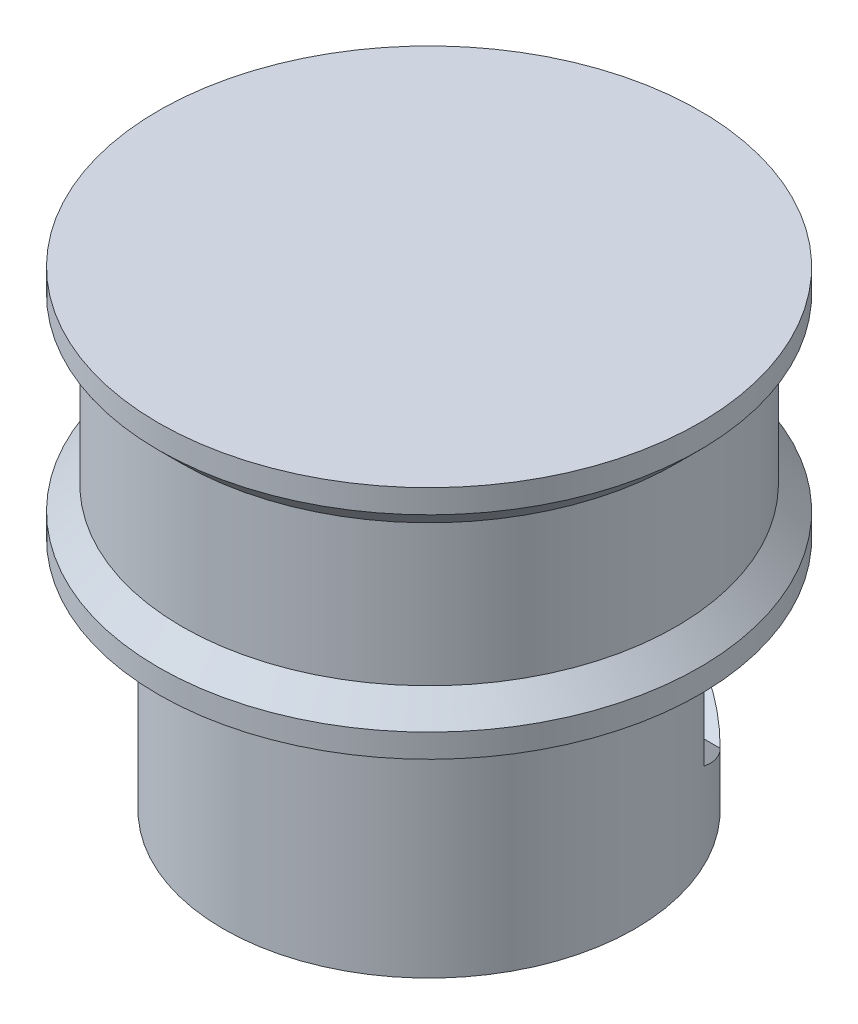
ISO-10303-21;
HEADER;
FILE_DESCRIPTION(('STEP AP214'),'2;1');
FILE_NAME('part.step','',(''),(''),'','','');
FILE_SCHEMA(('AUTOMOTIVE_DESIGN { 1 0 10303 214 1 1 1 1 }'));
ENDSEC;
DATA;
#1=APPLICATION_CONTEXT('core data for automotive mechanical design processes');
#2=APPLICATION_PROTOCOL_DEFINITION('international standard','automotive_design',2000,#1);
#3=PRODUCT_CONTEXT('',#1,'mechanical');
#4=PRODUCT('Part','Part','',(#3));
#5=PRODUCT_RELATED_PRODUCT_CATEGORY('part','',(#4));
#6=PRODUCT_DEFINITION_FORMATION('','',#4);
#7=PRODUCT_DEFINITION_CONTEXT('part definition',#1,'design');
#8=PRODUCT_DEFINITION('design','',#6,#7);
#9=PRODUCT_DEFINITION_SHAPE('','',#8);
#10=(LENGTH_UNIT() NAMED_UNIT(*) SI_UNIT(.MILLI.,.METRE.));
#11=(NAMED_UNIT(*) PLANE_ANGLE_UNIT() SI_UNIT($,.RADIAN.));
#12=(NAMED_UNIT(*) SI_UNIT($,.STERADIAN.) SOLID_ANGLE_UNIT());
#13=UNCERTAINTY_MEASURE_WITH_UNIT(LENGTH_MEASURE(1.E-05),#10,'distance_accuracy_value','');
#14=(GEOMETRIC_REPRESENTATION_CONTEXT(3) GLOBAL_UNCERTAINTY_ASSIGNED_CONTEXT((#13)) GLOBAL_UNIT_ASSIGNED_CONTEXT((#10,
#11,#12)) REPRESENTATION_CONTEXT('',''));
#15=CARTESIAN_POINT('',(0.,0.,0.));
#16=DIRECTION('',(0.,0.,1.));
#17=DIRECTION('',(1.,0.,0.));
#18=AXIS2_PLACEMENT_3D('',#15,#16,#17);
#19=CARTESIAN_POINT('',(0.,12.7,0.));
#20=DIRECTION('',(0.,-1.,0.));
#21=DIRECTION('',(0.,0.,-1.));
#22=AXIS2_PLACEMENT_3D('',#19,#20,#21);
#23=CYLINDRICAL_SURFACE('',#22,14.605);
#24=CARTESIAN_POINT('',(0.,1.27,0.));
#25=DIRECTION('',(0.,1.,0.));
#26=DIRECTION('',(0.,0.,1.));
#27=AXIS2_PLACEMENT_3D('',#24,#25,#26);
#28=CIRCLE('',#27,14.605);
#29=CARTESIAN_POINT('',(0.,1.27,14.605));
#30=VERTEX_POINT('',#29);
#31=EDGE_CURVE('E12',#30,#30,#28,.F.);
#32=ORIENTED_EDGE('',*,*,#31,.T.);
#33=EDGE_LOOP('',(#32));
#34=FACE_BOUND('',#33,.T.);
#35=CARTESIAN_POINT('',(0.,0.,0.));
#36=DIRECTION('',(0.,1.,0.));
#37=DIRECTION('',(0.,0.,1.));
#38=AXIS2_PLACEMENT_3D('',#35,#36,#37);
#39=CIRCLE('',#38,14.605);
#40=CARTESIAN_POINT('',(0.,0.,14.605));
#41=VERTEX_POINT('',#40);
#42=EDGE_CURVE('E214',#41,#41,#39,.T.);
#43=ORIENTED_EDGE('',*,*,#42,.T.);
#44=EDGE_LOOP('',(#43));
#45=FACE_BOUND('',#44,.T.);
#46=ADVANCED_FACE('F37',(#34,#45),#23,.T.);
#47=CARTESIAN_POINT('',(0.,12.7,0.));
#48=DIRECTION('',(0.,-1.,0.));
#49=DIRECTION('',(0.,0.,-1.));
#50=AXIS2_PLACEMENT_3D('',#47,#48,#49);
#51=CYLINDRICAL_SURFACE('',#50,11.1125);
#52=DIRECTION('',(0.,-1.,0.));
#53=VECTOR('',#52,1.);
#54=CARTESIAN_POINT('',(-3.,12.7,-10.6998904784114));
#55=LINE('',#54,#53);
#56=CARTESIAN_POINT('',(-3.,-4.30167123755782,-10.6998904784114));
#57=VERTEX_POINT('',#56);
#58=CARTESIAN_POINT('',(-3.,-8.39832876244218,-10.6998904784114));
#59=VERTEX_POINT('',#58);
#60=EDGE_CURVE('E220',#57,#59,#55,.T.);
#61=ORIENTED_EDGE('',*,*,#60,.F.);
#62=CARTESIAN_POINT('',(-3.,-8.39832876244218,-10.6998904784114));
#63=CARTESIAN_POINT('',(-3.13243341728704,-8.44980482977651,-10.6627525507003));
#64=CARTESIAN_POINT('',(-3.26405311631133,-8.50163081904438,-10.6232037491654));
#65=CARTESIAN_POINT('',(-3.52576098075471,-8.60524305247742,-10.5392405693442));
#66=CARTESIAN_POINT('',(-3.65584901639349,-8.657029292932,-10.4948257819942));
#67=CARTESIAN_POINT('',(-3.91487299697827,-8.759935014943,-10.4009822482557));
#68=CARTESIAN_POINT('',(-4.0438054915231,-8.81105263094523,-10.3515418974541));
#69=CARTESIAN_POINT('',(-4.30020231705208,-8.91186114581515,-10.2476852407426));
#70=CARTESIAN_POINT('',(-4.42766667120732,-8.96155206721835,-10.1932690134866));
#71=CARTESIAN_POINT('',(-4.81096554521833,-9.10879705970489,-10.0210464237337));
#72=CARTESIAN_POINT('',(-5.06455974235284,-9.20324394297481,-9.89540090211336));
#73=CARTESIAN_POINT('',(-5.56455282344206,-9.37890534177426,-9.62311827938996));
#74=CARTESIAN_POINT('',(-5.81095959995443,-9.46013485776748,-9.47650533459779));
#75=CARTESIAN_POINT('',(-6.33957228873554,-9.61738185840665,-9.13311203361688));
#76=CARTESIAN_POINT('',(-6.62016964872593,-9.68978465796962,-8.93205542661299));
#77=CARTESIAN_POINT('',(-7.02867090899986,-9.77111089439262,-8.60903849469821));
#78=CARTESIAN_POINT('',(-7.16259025867904,-9.79366051309312,-8.49796753261892));
#79=CARTESIAN_POINT('',(-7.42585646320655,-9.82818122010707,-8.26890001181333));
#80=CARTESIAN_POINT('',(-7.55520378020591,-9.84015338056556,-8.15090415629656));
#81=CARTESIAN_POINT('',(-7.78423388077972,-9.85067532803857,-7.93180060568224));
#82=CARTESIAN_POINT('',(-7.88485909345481,-9.85135416881234,-7.83177869414518));
#83=CARTESIAN_POINT('',(-8.08201023357715,-9.84367313033365,-7.628160144985));
#84=CARTESIAN_POINT('',(-8.17853806481465,-9.83531749767237,-7.52456520898644));
#85=CARTESIAN_POINT('',(-8.36691878086081,-9.80855613574044,-7.31452110964324));
#86=CARTESIAN_POINT('',(-8.45877374201249,-9.79015491352846,-7.20807324664537));
#87=CARTESIAN_POINT('',(-8.63721386569854,-9.74228698998651,-6.99325882911814));
#88=CARTESIAN_POINT('',(-8.72380036206532,-9.71282310308278,-6.88489276926848));
#89=CARTESIAN_POINT('',(-8.87276354510007,-9.64965088512435,-6.69127949828542));
#90=CARTESIAN_POINT('',(-8.9362954989821,-9.6182775693011,-6.60615577776476));
#91=CARTESIAN_POINT('',(-9.0594255110201,-9.54782544172924,-6.43626157232032));
#92=CARTESIAN_POINT('',(-9.11902444285384,-9.50874834903308,-6.35149101289215));
#93=CARTESIAN_POINT('',(-9.23400336264509,-9.42258895126509,-6.18314082737342));
#94=CARTESIAN_POINT('',(-9.28938306924887,-9.37550611301563,-6.09956128100566));
#95=CARTESIAN_POINT('',(-9.39562445441308,-9.27319166577318,-5.93460336985001));
#96=CARTESIAN_POINT('',(-9.44648835389353,-9.21796409840618,-5.8532239368745));
#97=CARTESIAN_POINT('',(-9.54388306481061,-9.09886216996525,-5.6930490082684));
#98=CARTESIAN_POINT('',(-9.59037707949362,-9.03492386961552,-5.61427854640971));
#99=CARTESIAN_POINT('',(-9.67839154599443,-8.89892665009483,-5.4611528519524));
#100=CARTESIAN_POINT('',(-9.71991435517951,-8.82687161163161,-5.38679553512439));
#101=CARTESIAN_POINT('',(-9.79791038763417,-8.67497416494964,-5.24359214869778));
#102=CARTESIAN_POINT('',(-9.834383998178,-8.59513235477894,-5.17474565658916));
#103=CARTESIAN_POINT('',(-9.90225392370233,-8.42820153383446,-5.04365678911851));
#104=CARTESIAN_POINT('',(-9.93365091040181,-8.34111348416811,-4.98141354041658));
#105=CARTESIAN_POINT('',(-9.98790947109742,-8.17134483062466,-4.87161230460642));
#106=CARTESIAN_POINT('',(-10.0113441051782,-8.08940524400511,-4.82318868765008));
#107=CARTESIAN_POINT('',(-10.0543833905357,-7.92102981163548,-4.73281492631125));
#108=CARTESIAN_POINT('',(-10.0739867811593,-7.83459249773568,-4.69086691364734));
#109=CARTESIAN_POINT('',(-10.1094133083686,-7.65795484211025,-4.61402351562608));
#110=CARTESIAN_POINT('',(-10.1252389342847,-7.567757024632,-4.57912348839865));
#111=CARTESIAN_POINT('',(-10.1532070767721,-7.38425996743428,-4.51676857181104));
#112=CARTESIAN_POINT('',(-10.1653482719869,-7.29095962832865,-4.48931635385031));
#113=CARTESIAN_POINT('',(-10.1950755361023,-7.01917073982062,-4.42159625935305));
#114=CARTESIAN_POINT('',(-10.2081244878767,-6.83760414025673,-4.39114566835907));
#115=CARTESIAN_POINT('',(-10.2218245569718,-6.47159708529345,-4.3591575881561));
#116=CARTESIAN_POINT('',(-10.2224776035088,-6.28715708156346,-4.35761559980493));
#117=CARTESIAN_POINT('',(-10.2115032821762,-5.92327846042109,-4.38326824805562));
#118=CARTESIAN_POINT('',(-10.2000500761826,-5.74380601210978,-4.41005534219828));
#119=CARTESIAN_POINT('',(-10.1648357481392,-5.39230200378413,-4.49062162226977));
#120=CARTESIAN_POINT('',(-10.1410752644478,-5.22027005834458,-4.54439940823144));
#121=CARTESIAN_POINT('',(-10.0806925665778,-4.88799974876595,-4.67681150212539));
#122=CARTESIAN_POINT('',(-10.044040277771,-4.72779003059166,-4.75550388880542));
#123=CARTESIAN_POINT('',(-9.95742859368821,-4.42378781671832,-4.93427773851973));
#124=CARTESIAN_POINT('',(-9.90746939492492,-4.27999507862276,-5.03435888568653));
#125=CARTESIAN_POINT('',(-9.79277902404163,-4.00900994346057,-5.25402497923301));
#126=CARTESIAN_POINT('',(-9.72774196468714,-3.88226165849192,-5.37399666896649));
#127=CARTESIAN_POINT('',(-9.58384654822467,-3.65131783394613,-5.6266021408756));
#128=CARTESIAN_POINT('',(-9.5049856010829,-3.54712652881931,-5.75923829373204));
#129=CARTESIAN_POINT('',(-9.32827450766633,-3.3553993124777,-6.04156935980791));
#130=CARTESIAN_POINT('',(-9.22948034498166,-3.26954450721492,-6.19180823945968));
#131=CARTESIAN_POINT('',(-9.01848458535151,-3.12341427957251,-6.49528760266278));
#132=CARTESIAN_POINT('',(-8.90627479255865,-3.0631545970944,-6.64852987275617));
#133=CARTESIAN_POINT('',(-8.7028253597325,-2.97951644475088,-6.91144657867696));
#134=CARTESIAN_POINT('',(-8.61430072159523,-2.95055315418673,-7.02151729053615));
#135=CARTESIAN_POINT('',(-8.43183938453787,-2.90395556983356,-7.23960932944621));
#136=CARTESIAN_POINT('',(-8.33790075866059,-2.8863253372034,-7.34762990839783));
#137=CARTESIAN_POINT('',(-8.14520578258219,-2.8613316024602,-7.56068400687645));
#138=CARTESIAN_POINT('',(-8.04644442681776,-2.85397901254006,-7.66571423573679));
#139=CARTESIAN_POINT('',(-7.84477011823316,-2.84849390013946,-7.87197945708909));
#140=CARTESIAN_POINT('',(-7.74185593651901,-2.85036412699293,-7.97321330881309));
#141=CARTESIAN_POINT('',(-7.48722571401828,-2.86487188092717,-8.2141133657444));
#142=CARTESIAN_POINT('',(-7.33360824214621,-2.88180607444971,-8.35152059594133));
#143=CARTESIAN_POINT('',(-7.02026531327553,-2.92968613541911,-8.61659476799056));
#144=CARTESIAN_POINT('',(-6.860537049932,-2.96063851310241,-8.7442571519769));
#145=CARTESIAN_POINT('',(-6.535360221756,-3.03427294548682,-8.98990654493486));
#146=CARTESIAN_POINT('',(-6.36989031754334,-3.07700406422404,-9.10785034157241));
#147=CARTESIAN_POINT('',(-6.03471944680998,-3.1719755249267,-9.33330693207956));
#148=CARTESIAN_POINT('',(-5.86501908345481,-3.22421451790607,-9.44082120238697));
#149=CARTESIAN_POINT('',(-5.47753437602384,-3.3508288027972,-9.67199598241565));
#150=CARTESIAN_POINT('',(-5.25867437107533,-3.42743384154141,-9.79263174603203));
#151=CARTESIAN_POINT('',(-4.81587823962596,-3.58936149193747,-10.0178204128388));
#152=CARTESIAN_POINT('',(-4.59193945063609,-3.67468876234346,-10.1223646456693));
#153=CARTESIAN_POINT('',(-4.14247434478499,-3.84963740314684,-10.3143829225623));
#154=CARTESIAN_POINT('',(-3.91700893712483,-3.93918640971435,-10.4020658527528));
#155=CARTESIAN_POINT('',(-3.57559070126086,-4.07488697759545,-10.5222306419537));
#156=CARTESIAN_POINT('',(-3.46131313570296,-4.12032405885825,-10.5603740316689));
#157=CARTESIAN_POINT('',(-3.2315695493736,-4.2111566924025,-10.6329255313705));
#158=CARTESIAN_POINT('',(-3.11610359094836,-4.25655224672788,-10.6673338362268));
#159=CARTESIAN_POINT('',(-3.,-4.30167123755782,-10.6998904784114));
#160=B_SPLINE_CURVE_WITH_KNOTS('',3,(#62,#63,#64,#65,#66,#67,#68,#69,#70,#71,#72,#73,#74,#75,
#76,#77,#78,#79,#80,#81,#82,#83,#84,#85,#86,#87,#88,#89,#90,#91,#92,#93,#94,#95,#96,#97,#98,#99,
#100,#101,#102,#103,#104,#105,#106,#107,#108,#109,#110,#111,#112,#113,#114,#115,#116,#117,#118,
#119,#120,#121,#122,#123,#124,#125,#126,#127,#128,#129,#130,#131,#132,#133,#134,#135,#136,#137,
#138,#139,#140,#141,#142,#143,#144,#145,#146,#147,#148,#149,#150,#151,#152,#153,#154,#155,#156,
#157,#158,#159),.UNSPECIFIED.,.F.,.F.,(4,2,2,2,2,2,2,2,2,2,2,2,2,2,2,2,2,2,2,2,2,2,2,2,2,2,2,2,
2,2,2,2,2,2,2,2,2,2,2,2,2,2,2,2,2,2,2,2,4),(0.,0.440552891296872,0.881142846535676,
1.32277432209703,1.76439881798219,2.65836429877934,3.55130802803301,4.60613613903465,
5.13205437839676,5.65791930387882,6.08321700367568,6.50831488212769,6.93322219253578,
7.35802147645039,7.68997899519869,8.02186252325401,8.35376816320801,8.68550965372346,
9.01983252146395,9.35399621857139,9.68813427105798,10.0222280754618,10.3159113243078,
10.6096910461753,10.9032766463451,11.1969674117511,11.7477449721189,12.2984368124275,
12.8413127955068,13.3841606233236,13.9282833251762,14.472397992024,15.0287035432551,
15.5851134351198,16.1805555220381,16.7763632519765,17.2083834116997,17.6405582980533,
18.0731916944932,18.5059540673177,19.1253965822861,19.7451270702931,20.3674790901448,
20.9897428788467,21.7730857412009,22.5568492140406,23.3301696817168,23.7163955506347,
24.1026012593795),.UNSPECIFIED.);
#161=EDGE_CURVE('E60',#59,#57,#160,.T.);
#162=ORIENTED_EDGE('',*,*,#161,.F.);
#163=EDGE_LOOP('',(#61,#162));
#164=FACE_BOUND('',#163,.T.);
#165=DIRECTION('',(0.,1.,0.));
#166=VECTOR('',#165,1.);
#167=CARTESIAN_POINT('',(0.999999999999999,-12.701,-11.0674141627573));
#168=LINE('',#167,#166);
#169=CARTESIAN_POINT('',(0.999999999999999,-12.7,-11.0674141627573));
#170=VERTEX_POINT('',#169);
#171=CARTESIAN_POINT('',(0.999999999999999,0.,-11.0674141627573));
#172=VERTEX_POINT('',#171);
#173=EDGE_CURVE('E139',#170,#172,#168,.T.);
#174=ORIENTED_EDGE('',*,*,#173,.T.);
#175=CARTESIAN_POINT('',(0.,0.,0.));
#176=DIRECTION('',(0.,-1.,0.));
#177=DIRECTION('',(0.,0.,-1.));
#178=AXIS2_PLACEMENT_3D('',#175,#176,#177);
#179=CIRCLE('',#178,11.1125);
#180=CARTESIAN_POINT('',(-1.,0.,-11.0674141627573));
#181=VERTEX_POINT('',#180);
#182=EDGE_CURVE('E53',#172,#181,#179,.T.);
#183=ORIENTED_EDGE('',*,*,#182,.T.);
#184=DIRECTION('',(0.,1.,0.));
#185=VECTOR('',#184,1.);
#186=CARTESIAN_POINT('',(-1.,-12.701,-11.0674141627573));
#187=LINE('',#186,#185);
#188=CARTESIAN_POINT('',(-1.,-12.7,-11.0674141627573));
#189=VERTEX_POINT('',#188);
#190=EDGE_CURVE('E134',#189,#181,#187,.T.);
#191=ORIENTED_EDGE('',*,*,#190,.F.);
#192=CARTESIAN_POINT('',(0.,-12.7,0.));
#193=DIRECTION('',(0.,1.,0.));
#194=DIRECTION('',(0.,0.,1.));
#195=AXIS2_PLACEMENT_3D('',#192,#193,#194);
#196=CIRCLE('',#195,11.1125);
#197=EDGE_CURVE('E143',#189,#170,#196,.T.);
#198=ORIENTED_EDGE('',*,*,#197,.T.);
#199=EDGE_LOOP('',(#174,#183,#191,#198));
#200=FACE_BOUND('',#199,.T.);
#201=CARTESIAN_POINT('',(0.,-14.3531554902754,0.));
#202=DIRECTION('',(0.,0.866025403784439,0.499999999999999));
#203=DIRECTION('',(0.,-0.5,0.866025403784439));
#204=AXIS2_PLACEMENT_3D('',#201,#202,#203);
#205=ELLIPSE('',#204,12.8316097327394,11.1125);
#206=CARTESIAN_POINT('',(7.85357409118882,-9.81410161513775,-7.86187193003089));
#207=VERTEX_POINT('',#206);
#208=CARTESIAN_POINT('',(3.,-8.17557084226509,-10.6998904784114));
#209=VERTEX_POINT('',#208);
#210=EDGE_CURVE('E147',#207,#209,#205,.T.);
#211=ORIENTED_EDGE('',*,*,#210,.F.);
#212=CARTESIAN_POINT('',(0.,-5.27504774000006,0.));
#213=DIRECTION('',(0.,0.866025403784439,-0.5));
#214=DIRECTION('',(0.,-0.5,-0.866025403784439));
#215=AXIS2_PLACEMENT_3D('',#212,#213,#214);
#216=ELLIPSE('',#215,12.8316097327394,11.1125);
#217=CARTESIAN_POINT('',(9.99249005933845,-8.08205080756887,-4.86187193003089));
#218=VERTEX_POINT('',#217);
#219=EDGE_CURVE('E244',#207,#218,#216,.F.);
#220=ORIENTED_EDGE('',*,*,#219,.T.);
#221=DIRECTION('',(0.,-1.,0.));
#222=VECTOR('',#221,1.);
#223=CARTESIAN_POINT('',(9.99249005933845,12.7,-4.86187193003089));
#224=LINE('',#223,#222);
#225=CARTESIAN_POINT('',(9.99249005933845,-4.61794919243113,-4.86187193003089));
#226=VERTEX_POINT('',#225);
#227=EDGE_CURVE('E247',#218,#226,#224,.F.);
#228=ORIENTED_EDGE('',*,*,#227,.T.);
#229=CARTESIAN_POINT('',(0.,-7.42495225999994,0.));
#230=DIRECTION('',(0.,-0.866025403784439,-0.5));
#231=DIRECTION('',(0.,-0.5,0.866025403784439));
#232=AXIS2_PLACEMENT_3D('',#229,#230,#231);
#233=ELLIPSE('',#232,12.8316097327394,11.1125);
#234=CARTESIAN_POINT('',(7.85357409118882,-2.88589838486225,-7.86187193003089));
#235=VERTEX_POINT('',#234);
#236=EDGE_CURVE('E250',#226,#235,#233,.F.);
#237=ORIENTED_EDGE('',*,*,#236,.T.);
#238=CARTESIAN_POINT('',(0.,1.65315549027545,0.));
#239=DIRECTION('',(0.,-0.866025403784439,0.5));
#240=DIRECTION('',(0.,-0.5,-0.866025403784439));
#241=AXIS2_PLACEMENT_3D('',#238,#239,#240);
#242=ELLIPSE('',#241,12.8316097327394,11.1125);
#243=CARTESIAN_POINT('',(3.,-4.52442915773491,-10.6998904784114));
#244=VERTEX_POINT('',#243);
#245=EDGE_CURVE('E148',#244,#235,#242,.T.);
#246=ORIENTED_EDGE('',*,*,#245,.F.);
#247=DIRECTION('',(0.,-1.,0.));
#248=VECTOR('',#247,1.);
#249=CARTESIAN_POINT('',(3.,12.7,-10.6998904784114));
#250=LINE('',#249,#248);
#251=EDGE_CURVE('E150',#209,#244,#250,.F.);
#252=ORIENTED_EDGE('',*,*,#251,.F.);
#253=EDGE_LOOP('',(#211,#220,#228,#237,#246,#252));
#254=FACE_BOUND('',#253,.T.);
#255=ADVANCED_FACE('F175',(#164,#200,#254),#51,.T.);
#256=CARTESIAN_POINT('',(0.,-12.7,0.));
#257=DIRECTION('',(0.,1.,0.));
#258=DIRECTION('',(0.,0.,1.));
#259=AXIS2_PLACEMENT_3D('',#256,#257,#258);
#260=PLANE('',#259);
#261=ORIENTED_EDGE('',*,*,#197,.F.);
#262=DIRECTION('',(0.,0.,-1.));
#263=VECTOR('',#262,1.);
#264=CARTESIAN_POINT('',(-1.,-12.7,-3.87298334620742));
#265=LINE('',#264,#263);
#266=CARTESIAN_POINT('',(-1.,-12.7,-4.65632969730452));
#267=VERTEX_POINT('',#266);
#268=EDGE_CURVE('E263',#267,#189,#265,.T.);
#269=ORIENTED_EDGE('',*,*,#268,.F.);
#270=CARTESIAN_POINT('',(0.,-12.7,0.));
#271=DIRECTION('',(0.,-1.,0.));
#272=DIRECTION('',(0.,0.,-1.));
#273=AXIS2_PLACEMENT_3D('',#270,#271,#272);
#274=CIRCLE('',#273,4.7625);
#275=CARTESIAN_POINT('',(1.,-12.7,-4.65632969730452));
#276=VERTEX_POINT('',#275);
#277=EDGE_CURVE('E136',#276,#267,#274,.T.);
#278=ORIENTED_EDGE('',*,*,#277,.F.);
#279=DIRECTION('',(0.,0.,1.));
#280=VECTOR('',#279,1.);
#281=CARTESIAN_POINT('',(1.,-12.7,-11.0674141627573));
#282=LINE('',#281,#280);
#283=EDGE_CURVE('E133',#170,#276,#282,.T.);
#284=ORIENTED_EDGE('',*,*,#283,.F.);
#285=EDGE_LOOP('',(#261,#269,#278,#284));
#286=FACE_BOUND('',#285,.T.);
#287=ADVANCED_FACE('F183',(#286),#260,.F.);
#288=CARTESIAN_POINT('',(0.,13.4703841816037,0.));
#289=DIRECTION('',(0.,-1.,0.));
#290=DIRECTION('',(0.,0.,-1.));
#291=AXIS2_PLACEMENT_3D('',#288,#289,#290);
#292=CYLINDRICAL_SURFACE('',#291,4.7625);
#293=ORIENTED_EDGE('',*,*,#277,.T.);
#294=DIRECTION('',(0.,-1.,0.));
#295=VECTOR('',#294,1.);
#296=CARTESIAN_POINT('',(-1.,13.4703841816037,-4.65632969730452));
#297=LINE('',#296,#295);
#298=CARTESIAN_POINT('',(-1.,0.,-4.65632969730452));
#299=VERTEX_POINT('',#298);
#300=EDGE_CURVE('E129',#299,#267,#297,.T.);
#301=ORIENTED_EDGE('',*,*,#300,.F.);
#302=CARTESIAN_POINT('',(0.,0.,0.));
#303=DIRECTION('',(0.,1.,0.));
#304=DIRECTION('',(0.,0.,1.));
#305=AXIS2_PLACEMENT_3D('',#302,#303,#304);
#306=CIRCLE('',#305,4.7625);
#307=CARTESIAN_POINT('',(1.,0.,-4.65632969730452));
#308=VERTEX_POINT('',#307);
#309=EDGE_CURVE('E115',#308,#299,#306,.F.);
#310=ORIENTED_EDGE('',*,*,#309,.F.);
#311=DIRECTION('',(0.,-1.,0.));
#312=VECTOR('',#311,1.);
#313=CARTESIAN_POINT('',(1.,13.4703841816037,-4.65632969730452));
#314=LINE('',#313,#312);
#315=EDGE_CURVE('E127',#276,#308,#314,.F.);
#316=ORIENTED_EDGE('',*,*,#315,.F.);
#317=EDGE_LOOP('',(#293,#301,#310,#316));
#318=FACE_BOUND('',#317,.T.);
#319=ADVANCED_FACE('F126',(#318),#292,.F.);
#320=CARTESIAN_POINT('',(1.,-12.701,-11.0674141627573));
#321=DIRECTION('',(1.,0.,0.));
#322=DIRECTION('',(0.,0.,-1.));
#323=AXIS2_PLACEMENT_3D('',#320,#321,#322);
#324=PLANE('',#323);
#325=CARTESIAN_POINT('',(1.,-6.35,-7.86187193003089));
#326=DIRECTION('',(1.,0.,0.));
#327=DIRECTION('',(0.,0.,-1.));
#328=AXIS2_PLACEMENT_3D('',#325,#326,#327);
#329=CIRCLE('',#328,1.69999999999999);
#330=CARTESIAN_POINT('',(1.,-6.35,-9.56187193003088));
#331=VERTEX_POINT('',#330);
#332=EDGE_CURVE('E225',#331,#331,#329,.T.);
#333=ORIENTED_EDGE('',*,*,#332,.T.);
#334=EDGE_LOOP('',(#333));
#335=FACE_BOUND('',#334,.T.);
#336=ORIENTED_EDGE('',*,*,#315,.T.);
#337=DIRECTION('',(0.,0.,-1.));
#338=VECTOR('',#337,1.);
#339=CARTESIAN_POINT('',(1.,0.,-11.0674141627573));
#340=LINE('',#339,#338);
#341=EDGE_CURVE('E112',#308,#172,#340,.T.);
#342=ORIENTED_EDGE('',*,*,#341,.T.);
#343=ORIENTED_EDGE('',*,*,#173,.F.);
#344=ORIENTED_EDGE('',*,*,#283,.T.);
#345=EDGE_LOOP('',(#336,#342,#343,#344));
#346=FACE_BOUND('',#345,.T.);
#347=ADVANCED_FACE('F131',(#335,#346),#324,.F.);
#348=CARTESIAN_POINT('',(-1.,-12.701,-3.87298334620742));
#349=DIRECTION('',(-1.,0.,0.));
#350=DIRECTION('',(0.,0.,1.));
#351=AXIS2_PLACEMENT_3D('',#348,#349,#350);
#352=PLANE('',#351);
#353=CARTESIAN_POINT('',(-1.,-6.35,-7.86187193003089));
#354=DIRECTION('',(-1.,0.,0.));
#355=DIRECTION('',(0.,0.,1.));
#356=AXIS2_PLACEMENT_3D('',#353,#354,#355);
#357=CIRCLE('',#356,1.69999999999999);
#358=CARTESIAN_POINT('',(-1.,-6.35,-6.1618719300309));
#359=VERTEX_POINT('',#358);
#360=EDGE_CURVE('E228',#359,#359,#357,.T.);
#361=ORIENTED_EDGE('',*,*,#360,.T.);
#362=EDGE_LOOP('',(#361));
#363=FACE_BOUND('',#362,.T.);
#364=ORIENTED_EDGE('',*,*,#190,.T.);
#365=DIRECTION('',(0.,0.,1.));
#366=VECTOR('',#365,1.);
#367=CARTESIAN_POINT('',(-1.,0.,-3.87298334620742));
#368=LINE('',#367,#366);
#369=EDGE_CURVE('E120',#181,#299,#368,.T.);
#370=ORIENTED_EDGE('',*,*,#369,.T.);
#371=ORIENTED_EDGE('',*,*,#300,.T.);
#372=ORIENTED_EDGE('',*,*,#268,.T.);
#373=EDGE_LOOP('',(#364,#370,#371,#372));
#374=FACE_BOUND('',#373,.T.);
#375=ADVANCED_FACE('F282',(#363,#374),#352,.F.);
#376=CARTESIAN_POINT('',(11.1135,-9.81410161513775,-7.86187193003089));
#377=DIRECTION('',(0.,0.866025403784439,0.499999999999999));
#378=DIRECTION('',(0.,-0.5,0.866025403784439));
#379=AXIS2_PLACEMENT_3D('',#376,#377,#378);
#380=PLANE('',#379);
#381=ORIENTED_EDGE('',*,*,#210,.T.);
#382=DIRECTION('',(0.,0.499999999999999,-0.866025403784439));
#383=VECTOR('',#382,1.);
#384=CARTESIAN_POINT('',(3.,-9.81410161513775,-7.86187193003089));
#385=LINE('',#384,#383);
#386=CARTESIAN_POINT('',(3.,-9.81410161513775,-7.86187193003089));
#387=VERTEX_POINT('',#386);
#388=EDGE_CURVE('E234',#387,#209,#385,.T.);
#389=ORIENTED_EDGE('',*,*,#388,.F.);
#390=DIRECTION('',(-1.,0.,0.));
#391=VECTOR('',#390,1.);
#392=CARTESIAN_POINT('',(11.1135,-9.81410161513775,-7.86187193003089));
#393=LINE('',#392,#391);
#394=EDGE_CURVE('E260',#207,#387,#393,.T.);
#395=ORIENTED_EDGE('',*,*,#394,.F.);
#396=EDGE_LOOP('',(#381,#389,#395));
#397=FACE_BOUND('',#396,.T.);
#398=ADVANCED_FACE('F286',(#397),#380,.T.);
#399=CARTESIAN_POINT('',(11.1135,-4.61794919243112,-10.8618719300309));
#400=DIRECTION('',(0.,-0.866025403784439,0.5));
#401=DIRECTION('',(0.,-0.5,-0.866025403784439));
#402=AXIS2_PLACEMENT_3D('',#399,#400,#401);
#403=PLANE('',#402);
#404=ORIENTED_EDGE('',*,*,#245,.T.);
#405=DIRECTION('',(-1.,0.,0.));
#406=VECTOR('',#405,1.);
#407=CARTESIAN_POINT('',(11.1135,-2.88589838486225,-7.86187193003089));
#408=LINE('',#407,#406);
#409=CARTESIAN_POINT('',(3.,-2.88589838486225,-7.86187193003089));
#410=VERTEX_POINT('',#409);
#411=EDGE_CURVE('E257',#235,#410,#408,.T.);
#412=ORIENTED_EDGE('',*,*,#411,.T.);
#413=DIRECTION('',(0.,0.5,0.866025403784439));
#414=VECTOR('',#413,1.);
#415=CARTESIAN_POINT('',(3.,-4.61794919243112,-10.8618719300309));
#416=LINE('',#415,#414);
#417=EDGE_CURVE('E236',#244,#410,#416,.T.);
#418=ORIENTED_EDGE('',*,*,#417,.F.);
#419=EDGE_LOOP('',(#404,#412,#418));
#420=FACE_BOUND('',#419,.T.);
#421=ADVANCED_FACE('F296',(#420),#403,.T.);
#422=CARTESIAN_POINT('',(3.,0.,0.));
#423=DIRECTION('',(1.,0.,0.));
#424=DIRECTION('',(0.,0.,-1.));
#425=AXIS2_PLACEMENT_3D('',#422,#423,#424);
#426=PLANE('',#425);
#427=CARTESIAN_POINT('',(3.,-6.35,-7.86187193003089));
#428=DIRECTION('',(1.,0.,0.));
#429=DIRECTION('',(0.,0.,-1.));
#430=AXIS2_PLACEMENT_3D('',#427,#428,#429);
#431=CIRCLE('',#430,1.69999999999999);
#432=CARTESIAN_POINT('',(3.,-6.35,-9.56187193003088));
#433=VERTEX_POINT('',#432);
#434=EDGE_CURVE('E222',#433,#433,#431,.T.);
#435=ORIENTED_EDGE('',*,*,#434,.F.);
#436=EDGE_LOOP('',(#435));
#437=FACE_BOUND('',#436,.T.);
#438=ORIENTED_EDGE('',*,*,#251,.T.);
#439=ORIENTED_EDGE('',*,*,#417,.T.);
#440=DIRECTION('',(0.,-0.5,0.866025403784439));
#441=VECTOR('',#440,1.);
#442=CARTESIAN_POINT('',(3.,-2.88589838486225,-7.86187193003089));
#443=LINE('',#442,#441);
#444=CARTESIAN_POINT('',(3.,-4.61794919243112,-4.86187193003089));
#445=VERTEX_POINT('',#444);
#446=EDGE_CURVE('E238',#410,#445,#443,.T.);
#447=ORIENTED_EDGE('',*,*,#446,.T.);
#448=DIRECTION('',(0.,-1.,0.));
#449=VECTOR('',#448,1.);
#450=CARTESIAN_POINT('',(3.,-4.61794919243112,-4.86187193003089));
#451=LINE('',#450,#449);
#452=CARTESIAN_POINT('',(3.,-8.08205080756887,-4.86187193003089));
#453=VERTEX_POINT('',#452);
#454=EDGE_CURVE('E241',#445,#453,#451,.T.);
#455=ORIENTED_EDGE('',*,*,#454,.T.);
#456=DIRECTION('',(0.,-0.5,-0.866025403784439));
#457=VECTOR('',#456,1.);
#458=CARTESIAN_POINT('',(3.,-8.08205080756887,-4.86187193003089));
#459=LINE('',#458,#457);
#460=EDGE_CURVE('E231',#453,#387,#459,.T.);
#461=ORIENTED_EDGE('',*,*,#460,.T.);
#462=ORIENTED_EDGE('',*,*,#388,.T.);
#463=EDGE_LOOP('',(#438,#439,#447,#455,#461,#462));
#464=FACE_BOUND('',#463,.T.);
#465=ADVANCED_FACE('F292',(#437,#464),#426,.T.);
#466=CARTESIAN_POINT('',(11.1135,-8.08205080756887,-4.86187193003089));
#467=DIRECTION('',(0.,0.866025403784439,-0.5));
#468=DIRECTION('',(0.,0.5,0.866025403784439));
#469=AXIS2_PLACEMENT_3D('',#466,#467,#468);
#470=PLANE('',#469);
#471=ORIENTED_EDGE('',*,*,#394,.T.);
#472=ORIENTED_EDGE('',*,*,#460,.F.);
#473=DIRECTION('',(-1.,0.,0.));
#474=VECTOR('',#473,1.);
#475=CARTESIAN_POINT('',(11.1135,-8.08205080756887,-4.86187193003089));
#476=LINE('',#475,#474);
#477=EDGE_CURVE('E253',#218,#453,#476,.T.);
#478=ORIENTED_EDGE('',*,*,#477,.F.);
#479=ORIENTED_EDGE('',*,*,#219,.F.);
#480=EDGE_LOOP('',(#471,#472,#478,#479));
#481=FACE_BOUND('',#480,.T.);
#482=ADVANCED_FACE('F288',(#481),#470,.T.);
#483=CARTESIAN_POINT('',(11.1135,-2.88589838486225,-7.86187193003089));
#484=DIRECTION('',(0.,-0.866025403784439,-0.5));
#485=DIRECTION('',(0.,0.5,-0.866025403784439));
#486=AXIS2_PLACEMENT_3D('',#483,#484,#485);
#487=PLANE('',#486);
#488=DIRECTION('',(-1.,0.,0.));
#489=VECTOR('',#488,1.);
#490=CARTESIAN_POINT('',(11.1135,-4.61794919243112,-4.86187193003089));
#491=LINE('',#490,#489);
#492=EDGE_CURVE('E255',#226,#445,#491,.T.);
#493=ORIENTED_EDGE('',*,*,#492,.T.);
#494=ORIENTED_EDGE('',*,*,#446,.F.);
#495=ORIENTED_EDGE('',*,*,#411,.F.);
#496=ORIENTED_EDGE('',*,*,#236,.F.);
#497=EDGE_LOOP('',(#493,#494,#495,#496));
#498=FACE_BOUND('',#497,.T.);
#499=ADVANCED_FACE('F291',(#498),#487,.T.);
#500=CARTESIAN_POINT('',(11.1135,-4.61794919243112,-4.86187193003089));
#501=DIRECTION('',(0.,0.,-1.));
#502=DIRECTION('',(-1.,0.,0.));
#503=AXIS2_PLACEMENT_3D('',#500,#501,#502);
#504=PLANE('',#503);
#505=ORIENTED_EDGE('',*,*,#477,.T.);
#506=ORIENTED_EDGE('',*,*,#454,.F.);
#507=ORIENTED_EDGE('',*,*,#492,.F.);
#508=ORIENTED_EDGE('',*,*,#227,.F.);
#509=EDGE_LOOP('',(#505,#506,#507,#508));
#510=FACE_BOUND('',#509,.T.);
#511=ADVANCED_FACE('F303',(#510),#504,.T.);
#512=CARTESIAN_POINT('',(3.,-6.35,-7.86187193003089));
#513=DIRECTION('',(1.,0.,0.));
#514=DIRECTION('',(0.,0.,-1.));
#515=AXIS2_PLACEMENT_3D('',#512,#513,#514);
#516=CYLINDRICAL_SURFACE('',#515,1.69999999999999);
#517=CARTESIAN_POINT('',(-3.,-6.35,-7.86187193003089));
#518=DIRECTION('',(1.,0.,0.));
#519=DIRECTION('',(0.,0.,-1.));
#520=AXIS2_PLACEMENT_3D('',#517,#518,#519);
#521=CIRCLE('',#520,1.69999999999999);
#522=CARTESIAN_POINT('',(-3.,-6.35,-9.56187193003088));
#523=VERTEX_POINT('',#522);
#524=EDGE_CURVE('E217',#523,#523,#521,.T.);
#525=ORIENTED_EDGE('',*,*,#524,.F.);
#526=EDGE_LOOP('',(#525));
#527=FACE_BOUND('',#526,.T.);
#528=ORIENTED_EDGE('',*,*,#360,.F.);
#529=EDGE_LOOP('',(#528));
#530=FACE_BOUND('',#529,.T.);
#531=ADVANCED_FACE('F203',(#527,#530),#516,.F.);
#532=ORIENTED_EDGE('',*,*,#434,.T.);
#533=EDGE_LOOP('',(#532));
#534=FACE_BOUND('',#533,.T.);
#535=ORIENTED_EDGE('',*,*,#332,.F.);
#536=EDGE_LOOP('',(#535));
#537=FACE_BOUND('',#536,.T.);
#538=ADVANCED_FACE('F196',(#534,#537),#516,.F.);
#539=CARTESIAN_POINT('',(-11.1135,-6.35,-7.86187193003089));
#540=DIRECTION('',(1.,0.,0.));
#541=DIRECTION('',(0.,0.,-1.));
#542=AXIS2_PLACEMENT_3D('',#539,#540,#541);
#543=CYLINDRICAL_SURFACE('',#542,3.5);
#544=ORIENTED_EDGE('',*,*,#161,.T.);
#545=CARTESIAN_POINT('',(-3.,-6.35,-7.86187193003089));
#546=DIRECTION('',(1.,0.,0.));
#547=DIRECTION('',(0.,0.,-1.));
#548=AXIS2_PLACEMENT_3D('',#545,#546,#547);
#549=CIRCLE('',#548,3.5);
#550=EDGE_CURVE('E212',#57,#59,#549,.T.);
#551=ORIENTED_EDGE('',*,*,#550,.T.);
#552=EDGE_LOOP('',(#544,#551));
#553=FACE_BOUND('',#552,.T.);
#554=ADVANCED_FACE('F188',(#553),#543,.F.);
#555=CARTESIAN_POINT('',(-3.,-6.35,-7.86187193003089));
#556=DIRECTION('',(1.,0.,0.));
#557=DIRECTION('',(0.,0.,-1.));
#558=AXIS2_PLACEMENT_3D('',#555,#556,#557);
#559=PLANE('',#558);
#560=ORIENTED_EDGE('',*,*,#60,.T.);
#561=ORIENTED_EDGE('',*,*,#550,.F.);
#562=EDGE_LOOP('',(#560,#561));
#563=FACE_BOUND('',#562,.T.);
#564=ORIENTED_EDGE('',*,*,#524,.T.);
#565=EDGE_LOOP('',(#564));
#566=FACE_BOUND('',#565,.T.);
#567=ADVANCED_FACE('F177',(#563,#566),#559,.F.);
#568=CARTESIAN_POINT('',(0.,0.,0.));
#569=DIRECTION('',(0.,1.,0.));
#570=DIRECTION('',(0.,0.,1.));
#571=AXIS2_PLACEMENT_3D('',#568,#569,#570);
#572=PLANE('',#571);
#573=ORIENTED_EDGE('',*,*,#42,.F.);
#574=EDGE_LOOP('',(#573));
#575=FACE_BOUND('',#574,.T.);
#576=ORIENTED_EDGE('',*,*,#341,.F.);
#577=ORIENTED_EDGE('',*,*,#309,.T.);
#578=ORIENTED_EDGE('',*,*,#369,.F.);
#579=ORIENTED_EDGE('',*,*,#182,.F.);
#580=EDGE_LOOP('',(#576,#577,#578,#579));
#581=FACE_BOUND('',#580,.T.);
#582=ADVANCED_FACE('F114',(#575,#581),#572,.F.);
#583=CARTESIAN_POINT('',(0.,-41.3091781569181,0.));
#584=DIRECTION('',(0.,1.,0.));
#585=DIRECTION('',(0.,0.,1.));
#586=AXIS2_PLACEMENT_3D('',#583,#584,#585);
#587=CYLINDRICAL_SURFACE('',#586,13.335);
#588=CARTESIAN_POINT('',(0.,2.54,0.));
#589=DIRECTION('',(0.,1.,0.));
#590=DIRECTION('',(0.,0.,1.));
#591=AXIS2_PLACEMENT_3D('',#588,#589,#590);
#592=CIRCLE('',#591,13.335);
#593=CARTESIAN_POINT('',(0.,2.54,13.335));
#594=VERTEX_POINT('',#593);
#595=EDGE_CURVE('E448',#594,#594,#592,.F.);
#596=ORIENTED_EDGE('',*,*,#595,.F.);
#597=EDGE_LOOP('',(#596));
#598=FACE_BOUND('',#597,.T.);
#599=CARTESIAN_POINT('',(0.,10.16,0.));
#600=DIRECTION('',(0.,1.,0.));
#601=DIRECTION('',(0.,0.,1.));
#602=AXIS2_PLACEMENT_3D('',#599,#600,#601);
#603=CIRCLE('',#602,13.335);
#604=CARTESIAN_POINT('',(0.,10.16,13.335));
#605=VERTEX_POINT('',#604);
#606=EDGE_CURVE('E450',#605,#605,#603,.T.);
#607=ORIENTED_EDGE('',*,*,#606,.F.);
#608=EDGE_LOOP('',(#607));
#609=FACE_BOUND('',#608,.T.);
#610=ADVANCED_FACE('F194',(#598,#609),#587,.T.);
#611=CARTESIAN_POINT('',(0.,12.7,0.));
#612=DIRECTION('',(0.,1.,0.));
#613=DIRECTION('',(0.,0.,1.));
#614=AXIS2_PLACEMENT_3D('',#611,#612,#613);
#615=PLANE('',#614);
#616=CARTESIAN_POINT('',(0.,12.7,0.));
#617=DIRECTION('',(0.,1.,0.));
#618=DIRECTION('',(0.,0.,1.));
#619=AXIS2_PLACEMENT_3D('',#616,#617,#618);
#620=CIRCLE('',#619,14.605);
#621=CARTESIAN_POINT('',(0.,12.7,14.605));
#622=VERTEX_POINT('',#621);
#623=EDGE_CURVE('E213',#622,#622,#620,.T.);
#624=ORIENTED_EDGE('',*,*,#623,.T.);
#625=EDGE_LOOP('',(#624));
#626=FACE_BOUND('',#625,.T.);
#627=ADVANCED_FACE('F169',(#626),#615,.T.);
#628=CARTESIAN_POINT('',(0.,11.43,0.));
#629=DIRECTION('',(0.,1.,0.));
#630=DIRECTION('',(0.,0.,1.));
#631=AXIS2_PLACEMENT_3D('',#628,#629,#630);
#632=CIRCLE('',#631,14.605);
#633=CARTESIAN_POINT('',(0.,11.43,14.605));
#634=VERTEX_POINT('',#633);
#635=EDGE_CURVE('E46',#634,#634,#632,.T.);
#636=ORIENTED_EDGE('',*,*,#635,.T.);
#637=EDGE_LOOP('',(#636));
#638=FACE_BOUND('',#637,.T.);
#639=ORIENTED_EDGE('',*,*,#623,.F.);
#640=EDGE_LOOP('',(#639));
#641=FACE_BOUND('',#640,.T.);
#642=ADVANCED_FACE('F158',(#638,#641),#23,.T.);
#643=CARTESIAN_POINT('',(0.,11.43,0.));
#644=DIRECTION('',(0.,1.,0.));
#645=DIRECTION('',(0.,0.,1.));
#646=AXIS2_PLACEMENT_3D('',#643,#644,#645);
#647=CONICAL_SURFACE('',#646,14.605,0.78539816339745);
#648=ORIENTED_EDGE('',*,*,#606,.T.);
#649=EDGE_LOOP('',(#648));
#650=FACE_BOUND('',#649,.T.);
#651=ORIENTED_EDGE('',*,*,#635,.F.);
#652=EDGE_LOOP('',(#651));
#653=FACE_BOUND('',#652,.T.);
#654=ADVANCED_FACE('F161',(#650,#653),#647,.T.);
#655=CARTESIAN_POINT('',(0.,1.27,0.));
#656=DIRECTION('',(0.,-1.,0.));
#657=DIRECTION('',(0.,0.,-1.));
#658=AXIS2_PLACEMENT_3D('',#655,#656,#657);
#659=CONICAL_SURFACE('',#658,14.605,0.785398163397448);
#660=ORIENTED_EDGE('',*,*,#595,.T.);
#661=EDGE_LOOP('',(#660));
#662=FACE_BOUND('',#661,.T.);
#663=ORIENTED_EDGE('',*,*,#31,.F.);
#664=EDGE_LOOP('',(#663));
#665=FACE_BOUND('',#664,.T.);
#666=ADVANCED_FACE('F40',(#662,#665),#659,.T.);
#667=CLOSED_SHELL('',(#46,#255,#287,#319,#347,#375,#398,#421,#465,#482,#499,#511,#531,#538,#554,
#567,#582,#610,#627,#642,#654,#666));
#668=MANIFOLD_SOLID_BREP('B2',#667);
#669=ADVANCED_BREP_SHAPE_REPRESENTATION('',(#18,#668),#14);
#670=SHAPE_DEFINITION_REPRESENTATION(#9,#669);
ENDSEC;
END-ISO-10303-21;
